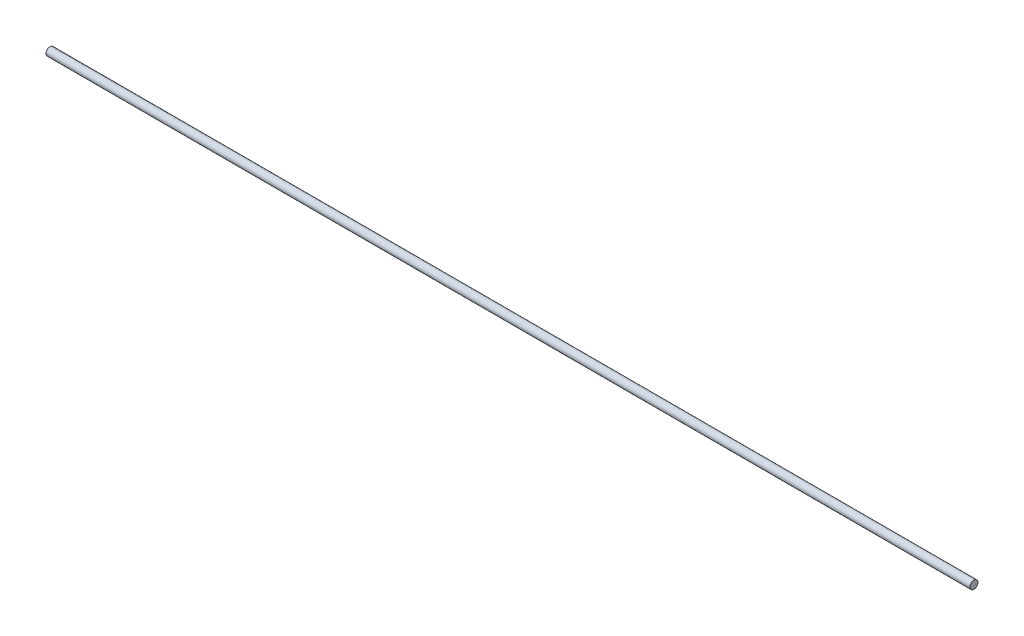
ISO-10303-21;
HEADER;
FILE_DESCRIPTION(('STEP AP214'),'2;1');
FILE_NAME('part.step','',(''),(''),'','','');
FILE_SCHEMA(('AUTOMOTIVE_DESIGN { 1 0 10303 214 1 1 1 1 }'));
ENDSEC;
DATA;
#1=APPLICATION_CONTEXT('core data for automotive mechanical design processes');
#2=APPLICATION_PROTOCOL_DEFINITION('international standard','automotive_design',2000,#1);
#3=PRODUCT_CONTEXT('',#1,'mechanical');
#4=PRODUCT('Part','Part','',(#3));
#5=PRODUCT_RELATED_PRODUCT_CATEGORY('part','',(#4));
#6=PRODUCT_DEFINITION_FORMATION('','',#4);
#7=PRODUCT_DEFINITION_CONTEXT('part definition',#1,'design');
#8=PRODUCT_DEFINITION('design','',#6,#7);
#9=PRODUCT_DEFINITION_SHAPE('','',#8);
#10=(LENGTH_UNIT() NAMED_UNIT(*) SI_UNIT(.MILLI.,.METRE.));
#11=(NAMED_UNIT(*) PLANE_ANGLE_UNIT() SI_UNIT($,.RADIAN.));
#12=(NAMED_UNIT(*) SI_UNIT($,.STERADIAN.) SOLID_ANGLE_UNIT());
#13=UNCERTAINTY_MEASURE_WITH_UNIT(LENGTH_MEASURE(1.E-05),#10,'distance_accuracy_value','');
#14=(GEOMETRIC_REPRESENTATION_CONTEXT(3) GLOBAL_UNCERTAINTY_ASSIGNED_CONTEXT((#13)) GLOBAL_UNIT_ASSIGNED_CONTEXT((#10,
#11,#12)) REPRESENTATION_CONTEXT('',''));
#15=CARTESIAN_POINT('',(0.,0.,0.));
#16=DIRECTION('',(0.,0.,1.));
#17=DIRECTION('',(1.,0.,0.));
#18=AXIS2_PLACEMENT_3D('',#15,#16,#17);
#19=CARTESIAN_POINT('',(914.4,0.,0.));
#20=DIRECTION('',(-1.,0.,0.));
#21=DIRECTION('',(0.,0.,1.));
#22=AXIS2_PLACEMENT_3D('',#19,#20,#21);
#23=CYLINDRICAL_SURFACE('',#22,3.96875);
#24=CARTESIAN_POINT('',(914.4,0.,0.));
#25=DIRECTION('',(1.,0.,0.));
#26=DIRECTION('',(0.,0.,-1.));
#27=AXIS2_PLACEMENT_3D('',#24,#25,#26);
#28=CIRCLE('',#27,3.96875);
#29=CARTESIAN_POINT('',(914.4,0.,3.96875));
#30=VERTEX_POINT('',#29);
#31=EDGE_CURVE('E10',#30,#30,#28,.T.);
#32=CARTESIAN_POINT('',(0.,0.,0.));
#33=DIRECTION('',(1.,0.,0.));
#34=DIRECTION('',(0.,0.,-1.));
#35=AXIS2_PLACEMENT_3D('',#32,#33,#34);
#36=CIRCLE('',#35,3.96875);
#37=CARTESIAN_POINT('',(-1.11022302462516E-13,0.,3.96875));
#38=VERTEX_POINT('',#37);
#39=EDGE_CURVE('E34',#38,#38,#36,.T.);
#40=CARTESIAN_POINT('',(914.4,0.,3.96875));
#41=CARTESIAN_POINT('',(904.875,0.,3.96875));
#42=CARTESIAN_POINT('',(895.35,0.,3.96875));
#43=CARTESIAN_POINT('',(876.3,0.,3.96875));
#44=CARTESIAN_POINT('',(866.775,0.,3.96875));
#45=CARTESIAN_POINT('',(847.725,0.,3.96875));
#46=CARTESIAN_POINT('',(838.2,0.,3.96875));
#47=CARTESIAN_POINT('',(819.15,0.,3.96875));
#48=CARTESIAN_POINT('',(809.625,0.,3.96875));
#49=CARTESIAN_POINT('',(790.575,0.,3.96875));
#50=CARTESIAN_POINT('',(781.05,0.,3.96875));
#51=CARTESIAN_POINT('',(762.,0.,3.96875));
#52=CARTESIAN_POINT('',(752.475,0.,3.96875));
#53=CARTESIAN_POINT('',(733.425,0.,3.96875));
#54=CARTESIAN_POINT('',(723.9,0.,3.96875));
#55=CARTESIAN_POINT('',(704.85,0.,3.96875));
#56=CARTESIAN_POINT('',(695.325,0.,3.96875));
#57=CARTESIAN_POINT('',(676.275,0.,3.96875));
#58=CARTESIAN_POINT('',(666.75,0.,3.96875));
#59=CARTESIAN_POINT('',(647.7,0.,3.96875));
#60=CARTESIAN_POINT('',(638.175,0.,3.96875));
#61=CARTESIAN_POINT('',(619.125,0.,3.96875));
#62=CARTESIAN_POINT('',(609.6,0.,3.96875));
#63=CARTESIAN_POINT('',(590.55,0.,3.96875));
#64=CARTESIAN_POINT('',(581.025,0.,3.96875));
#65=CARTESIAN_POINT('',(561.975,0.,3.96875));
#66=CARTESIAN_POINT('',(552.45,0.,3.96875));
#67=CARTESIAN_POINT('',(533.4,0.,3.96875));
#68=CARTESIAN_POINT('',(523.875,0.,3.96875));
#69=CARTESIAN_POINT('',(504.825,0.,3.96875));
#70=CARTESIAN_POINT('',(495.3,0.,3.96875));
#71=CARTESIAN_POINT('',(476.25,0.,3.96875));
#72=CARTESIAN_POINT('',(466.725,0.,3.96875));
#73=CARTESIAN_POINT('',(447.675,0.,3.96875));
#74=CARTESIAN_POINT('',(438.15,0.,3.96875));
#75=CARTESIAN_POINT('',(419.1,0.,3.96875));
#76=CARTESIAN_POINT('',(409.575,0.,3.96875));
#77=CARTESIAN_POINT('',(390.525,0.,3.96875));
#78=CARTESIAN_POINT('',(381.,0.,3.96875));
#79=CARTESIAN_POINT('',(361.95,0.,3.96875));
#80=CARTESIAN_POINT('',(352.425,0.,3.96875));
#81=CARTESIAN_POINT('',(333.375,0.,3.96875));
#82=CARTESIAN_POINT('',(323.85,0.,3.96875));
#83=CARTESIAN_POINT('',(304.8,0.,3.96875));
#84=CARTESIAN_POINT('',(295.275,0.,3.96875));
#85=CARTESIAN_POINT('',(276.225,0.,3.96875));
#86=CARTESIAN_POINT('',(266.7,0.,3.96875));
#87=CARTESIAN_POINT('',(247.65,0.,3.96875));
#88=CARTESIAN_POINT('',(238.125,0.,3.96875));
#89=CARTESIAN_POINT('',(219.075,0.,3.96875));
#90=CARTESIAN_POINT('',(209.55,0.,3.96875));
#91=CARTESIAN_POINT('',(190.5,0.,3.96875));
#92=CARTESIAN_POINT('',(180.975,0.,3.96875));
#93=CARTESIAN_POINT('',(161.925,0.,3.96875));
#94=CARTESIAN_POINT('',(152.4,0.,3.96875));
#95=CARTESIAN_POINT('',(133.35,0.,3.96875));
#96=CARTESIAN_POINT('',(123.825,0.,3.96875));
#97=CARTESIAN_POINT('',(104.775,0.,3.96875));
#98=CARTESIAN_POINT('',(95.2499999999999,0.,3.96875));
#99=CARTESIAN_POINT('',(76.1999999999999,0.,3.96875));
#100=CARTESIAN_POINT('',(66.6749999999999,0.,3.96875));
#101=CARTESIAN_POINT('',(47.6249999999999,0.,3.96875));
#102=CARTESIAN_POINT('',(38.0999999999999,0.,3.96875));
#103=CARTESIAN_POINT('',(19.0499999999999,0.,3.96875));
#104=CARTESIAN_POINT('',(9.52499999999988,0.,3.96875));
#105=CARTESIAN_POINT('',(-1.11022302462516E-13,0.,3.96875));
#106=B_SPLINE_CURVE_WITH_KNOTS('',3,(#40,#41,#42,#43,#44,#45,#46,#47,#48,#49,#50,#51,#52,#53,
#54,#55,#56,#57,#58,#59,#60,#61,#62,#63,#64,#65,#66,#67,#68,#69,#70,#71,#72,#73,#74,#75,#76,#77,
#78,#79,#80,#81,#82,#83,#84,#85,#86,#87,#88,#89,#90,#91,#92,#93,#94,#95,#96,#97,#98,#99,#100,
#101,#102,#103,#104,#105),.UNSPECIFIED.,.F.,.F.,(4,2,2,2,2,2,2,2,2,2,2,2,2,2,2,2,2,2,2,2,2,2,2,
2,2,2,2,2,2,2,2,2,4),(0.,28.575,57.15,85.7250000000001,114.3,142.875,171.45,200.025,228.6,
257.175,285.75,314.325,342.9,371.475,400.05,428.625,457.2,485.775,514.35,542.925,571.5,600.075,
628.65,657.225,685.8,714.375,742.95,771.525,800.1,828.675,857.25,885.825,914.4),.UNSPECIFIED.);
#107=EDGE_CURVE('BSEAM31',#30,#38,#106,.T.);
#108=ORIENTED_EDGE('',*,*,#31,.F.);
#109=ORIENTED_EDGE('',*,*,#39,.T.);
#110=ORIENTED_EDGE('',*,*,#107,.T.);
#111=ORIENTED_EDGE('',*,*,#107,.F.);
#112=EDGE_LOOP('',(#108,#110,#109,#111));
#113=FACE_BOUND('',#112,.T.);
#114=ADVANCED_FACE('F31',(#113),#23,.T.);
#115=CARTESIAN_POINT('',(914.4,0.,0.));
#116=DIRECTION('',(1.,0.,0.));
#117=DIRECTION('',(0.,0.,-1.));
#118=AXIS2_PLACEMENT_3D('',#115,#116,#117);
#119=PLANE('',#118);
#120=ORIENTED_EDGE('',*,*,#31,.T.);
#121=EDGE_LOOP('',(#120));
#122=FACE_BOUND('',#121,.T.);
#123=ADVANCED_FACE('F46',(#122),#119,.T.);
#124=CARTESIAN_POINT('',(0.,0.,0.));
#125=DIRECTION('',(1.,0.,0.));
#126=DIRECTION('',(0.,0.,-1.));
#127=AXIS2_PLACEMENT_3D('',#124,#125,#126);
#128=PLANE('',#127);
#129=ORIENTED_EDGE('',*,*,#39,.F.);
#130=EDGE_LOOP('',(#129));
#131=FACE_BOUND('',#130,.T.);
#132=ADVANCED_FACE('F44',(#131),#128,.F.);
#133=CLOSED_SHELL('',(#114,#123,#132));
#134=MANIFOLD_SOLID_BREP('B2',#133);
#135=ADVANCED_BREP_SHAPE_REPRESENTATION('',(#18,#134),#14);
#136=SHAPE_DEFINITION_REPRESENTATION(#9,#135);
ENDSEC;
END-ISO-10303-21;
